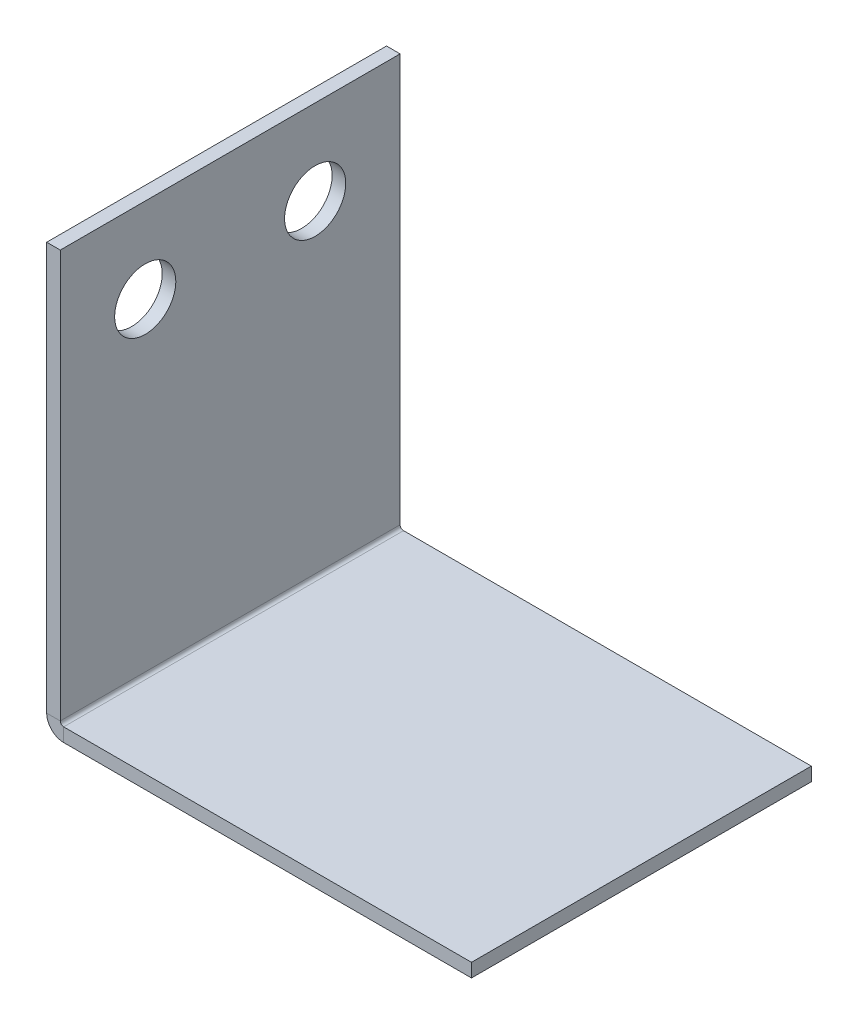
ISO-10303-21;
HEADER;
FILE_DESCRIPTION(('STEP AP214'),'2;1');
FILE_NAME('part.step','',(''),(''),'','','');
FILE_SCHEMA(('AUTOMOTIVE_DESIGN { 1 0 10303 214 1 1 1 1 }'));
ENDSEC;
DATA;
#1=APPLICATION_CONTEXT('core data for automotive mechanical design processes');
#2=APPLICATION_PROTOCOL_DEFINITION('international standard','automotive_design',2000,#1);
#3=PRODUCT_CONTEXT('',#1,'mechanical');
#4=PRODUCT('Part','Part','',(#3));
#5=PRODUCT_RELATED_PRODUCT_CATEGORY('part','',(#4));
#6=PRODUCT_DEFINITION_FORMATION('','',#4);
#7=PRODUCT_DEFINITION_CONTEXT('part definition',#1,'design');
#8=PRODUCT_DEFINITION('design','',#6,#7);
#9=PRODUCT_DEFINITION_SHAPE('','',#8);
#10=(LENGTH_UNIT() NAMED_UNIT(*) SI_UNIT(.MILLI.,.METRE.));
#11=(NAMED_UNIT(*) PLANE_ANGLE_UNIT() SI_UNIT($,.RADIAN.));
#12=(NAMED_UNIT(*) SI_UNIT($,.STERADIAN.) SOLID_ANGLE_UNIT());
#13=UNCERTAINTY_MEASURE_WITH_UNIT(LENGTH_MEASURE(1.E-05),#10,'distance_accuracy_value','');
#14=(GEOMETRIC_REPRESENTATION_CONTEXT(3) GLOBAL_UNCERTAINTY_ASSIGNED_CONTEXT((#13)) GLOBAL_UNIT_ASSIGNED_CONTEXT((#10,
#11,#12)) REPRESENTATION_CONTEXT('',''));
#15=CARTESIAN_POINT('',(0.,0.,0.));
#16=DIRECTION('',(0.,0.,1.));
#17=DIRECTION('',(1.,0.,0.));
#18=AXIS2_PLACEMENT_3D('',#15,#16,#17);
#19=CARTESIAN_POINT('',(0.,-120.,100.));
#20=DIRECTION('',(0.,0.,1.));
#21=DIRECTION('',(1.,0.,0.));
#22=AXIS2_PLACEMENT_3D('',#19,#20,#21);
#23=PLANE('',#22);
#24=DIRECTION('',(1.,0.,0.));
#25=VECTOR('',#24,1.);
#26=CARTESIAN_POINT('',(0.,-120.,100.));
#27=LINE('',#26,#25);
#28=CARTESIAN_POINT('',(0.,-120.,100.));
#29=VERTEX_POINT('',#28);
#30=CARTESIAN_POINT('',(4.00000000000002,-120.,100.));
#31=VERTEX_POINT('',#30);
#32=EDGE_CURVE('E11',#29,#31,#27,.T.);
#33=ORIENTED_EDGE('',*,*,#32,.F.);
#34=CARTESIAN_POINT('',(5.00000000000002,-120.,100.));
#35=DIRECTION('',(0.,0.,-1.));
#36=DIRECTION('',(-1.,0.,0.));
#37=AXIS2_PLACEMENT_3D('',#34,#35,#36);
#38=CIRCLE('',#37,5.);
#39=CARTESIAN_POINT('',(5.00000000000002,-125.,100.));
#40=VERTEX_POINT('',#39);
#41=EDGE_CURVE('E128',#29,#40,#38,.F.);
#42=ORIENTED_EDGE('',*,*,#41,.T.);
#43=DIRECTION('',(0.,-1.,0.));
#44=VECTOR('',#43,1.);
#45=CARTESIAN_POINT('',(5.00000000000002,-121.,100.));
#46=LINE('',#45,#44);
#47=CARTESIAN_POINT('',(5.00000000000002,-121.,100.));
#48=VERTEX_POINT('',#47);
#49=EDGE_CURVE('E45',#48,#40,#46,.T.);
#50=ORIENTED_EDGE('',*,*,#49,.F.);
#51=CARTESIAN_POINT('',(5.00000000000002,-120.,100.));
#52=DIRECTION('',(0.,0.,1.));
#53=DIRECTION('',(1.,0.,0.));
#54=AXIS2_PLACEMENT_3D('',#51,#52,#53);
#55=CIRCLE('',#54,1.);
#56=EDGE_CURVE('E135',#31,#48,#55,.T.);
#57=ORIENTED_EDGE('',*,*,#56,.F.);
#58=EDGE_LOOP('',(#33,#42,#50,#57));
#59=FACE_BOUND('',#58,.T.);
#60=ADVANCED_FACE('F36',(#59),#23,.T.);
#61=CARTESIAN_POINT('',(5.00000000000002,-121.,100.));
#62=DIRECTION('',(0.,0.,1.));
#63=DIRECTION('',(1.,0.,0.));
#64=AXIS2_PLACEMENT_3D('',#61,#62,#63);
#65=PLANE('',#64);
#66=DIRECTION('',(0.,-1.,0.));
#67=VECTOR('',#66,1.);
#68=CARTESIAN_POINT('',(0.,0.,100.));
#69=LINE('',#68,#67);
#70=CARTESIAN_POINT('',(0.,0.,100.));
#71=VERTEX_POINT('',#70);
#72=EDGE_CURVE('E123',#71,#29,#69,.T.);
#73=ORIENTED_EDGE('',*,*,#72,.T.);
#74=ORIENTED_EDGE('',*,*,#32,.T.);
#75=DIRECTION('',(0.,-1.,0.));
#76=VECTOR('',#75,1.);
#77=CARTESIAN_POINT('',(4.,0.,100.));
#78=LINE('',#77,#76);
#79=CARTESIAN_POINT('',(4.,0.,100.));
#80=VERTEX_POINT('',#79);
#81=EDGE_CURVE('E133',#80,#31,#78,.T.);
#82=ORIENTED_EDGE('',*,*,#81,.F.);
#83=DIRECTION('',(1.,0.,0.));
#84=VECTOR('',#83,1.);
#85=CARTESIAN_POINT('',(0.,0.,100.));
#86=LINE('',#85,#84);
#87=EDGE_CURVE('E114',#71,#80,#86,.T.);
#88=ORIENTED_EDGE('',*,*,#87,.F.);
#89=EDGE_LOOP('',(#73,#74,#82,#88));
#90=FACE_BOUND('',#89,.T.);
#91=ADVANCED_FACE('F131',(#90),#65,.T.);
#92=CARTESIAN_POINT('',(5.00000000000002,-125.,0.));
#93=DIRECTION('',(0.,0.,-1.));
#94=DIRECTION('',(-1.,0.,0.));
#95=AXIS2_PLACEMENT_3D('',#92,#93,#94);
#96=PLANE('',#95);
#97=DIRECTION('',(0.,1.,0.));
#98=VECTOR('',#97,1.);
#99=CARTESIAN_POINT('',(5.00000000000002,-125.,0.));
#100=LINE('',#99,#98);
#101=CARTESIAN_POINT('',(5.00000000000002,-125.,0.));
#102=VERTEX_POINT('',#101);
#103=CARTESIAN_POINT('',(5.00000000000002,-121.,0.));
#104=VERTEX_POINT('',#103);
#105=EDGE_CURVE('E89',#102,#104,#100,.T.);
#106=ORIENTED_EDGE('',*,*,#105,.F.);
#107=CARTESIAN_POINT('',(5.00000000000002,-120.,0.));
#108=DIRECTION('',(0.,0.,-1.));
#109=DIRECTION('',(-1.,0.,0.));
#110=AXIS2_PLACEMENT_3D('',#107,#108,#109);
#111=CIRCLE('',#110,5.);
#112=CARTESIAN_POINT('',(0.,-120.,0.));
#113=VERTEX_POINT('',#112);
#114=EDGE_CURVE('E157',#113,#102,#111,.F.);
#115=ORIENTED_EDGE('',*,*,#114,.F.);
#116=DIRECTION('',(-1.,0.,0.));
#117=VECTOR('',#116,1.);
#118=CARTESIAN_POINT('',(4.00000000000002,-120.,0.));
#119=LINE('',#118,#117);
#120=CARTESIAN_POINT('',(4.00000000000002,-120.,0.));
#121=VERTEX_POINT('',#120);
#122=EDGE_CURVE('E82',#121,#113,#119,.T.);
#123=ORIENTED_EDGE('',*,*,#122,.F.);
#124=CARTESIAN_POINT('',(5.00000000000002,-120.,0.));
#125=DIRECTION('',(0.,0.,1.));
#126=DIRECTION('',(1.,0.,0.));
#127=AXIS2_PLACEMENT_3D('',#124,#125,#126);
#128=CIRCLE('',#127,1.);
#129=EDGE_CURVE('E150',#121,#104,#128,.T.);
#130=ORIENTED_EDGE('',*,*,#129,.T.);
#131=EDGE_LOOP('',(#106,#115,#123,#130));
#132=FACE_BOUND('',#131,.T.);
#133=ADVANCED_FACE('F211',(#132),#96,.T.);
#134=CARTESIAN_POINT('',(4.00000000000002,-120.,0.));
#135=DIRECTION('',(0.,0.,-1.));
#136=DIRECTION('',(-1.,0.,0.));
#137=AXIS2_PLACEMENT_3D('',#134,#135,#136);
#138=PLANE('',#137);
#139=DIRECTION('',(1.,0.,0.));
#140=VECTOR('',#139,1.);
#141=CARTESIAN_POINT('',(0.,-125.,0.));
#142=LINE('',#141,#140);
#143=CARTESIAN_POINT('',(125.,-125.,0.));
#144=VERTEX_POINT('',#143);
#145=EDGE_CURVE('E141',#102,#144,#142,.T.);
#146=ORIENTED_EDGE('',*,*,#145,.F.);
#147=ORIENTED_EDGE('',*,*,#105,.T.);
#148=DIRECTION('',(1.,0.,0.));
#149=VECTOR('',#148,1.);
#150=CARTESIAN_POINT('',(0.,-121.,0.));
#151=LINE('',#150,#149);
#152=CARTESIAN_POINT('',(125.,-121.,0.));
#153=VERTEX_POINT('',#152);
#154=EDGE_CURVE('E147',#104,#153,#151,.T.);
#155=ORIENTED_EDGE('',*,*,#154,.T.);
#156=DIRECTION('',(0.,-1.,0.));
#157=VECTOR('',#156,1.);
#158=CARTESIAN_POINT('',(125.,-121.,0.));
#159=LINE('',#158,#157);
#160=EDGE_CURVE('E144',#153,#144,#159,.T.);
#161=ORIENTED_EDGE('',*,*,#160,.T.);
#162=EDGE_LOOP('',(#146,#147,#155,#161));
#163=FACE_BOUND('',#162,.T.);
#164=ADVANCED_FACE('F213',(#163),#138,.T.);
#165=CARTESIAN_POINT('',(0.,-125.,100.));
#166=DIRECTION('',(0.,1.,0.));
#167=DIRECTION('',(0.,0.,1.));
#168=AXIS2_PLACEMENT_3D('',#165,#166,#167);
#169=PLANE('',#168);
#170=ORIENTED_EDGE('',*,*,#145,.T.);
#171=DIRECTION('',(0.,0.,-1.));
#172=VECTOR('',#171,1.);
#173=CARTESIAN_POINT('',(125.,-125.,100.));
#174=LINE('',#173,#172);
#175=CARTESIAN_POINT('',(125.,-125.,100.));
#176=VERTEX_POINT('',#175);
#177=EDGE_CURVE('E171',#176,#144,#174,.T.);
#178=ORIENTED_EDGE('',*,*,#177,.F.);
#179=DIRECTION('',(1.,0.,0.));
#180=VECTOR('',#179,1.);
#181=CARTESIAN_POINT('',(0.,-125.,100.));
#182=LINE('',#181,#180);
#183=EDGE_CURVE('E95',#40,#176,#182,.T.);
#184=ORIENTED_EDGE('',*,*,#183,.F.);
#185=DIRECTION('',(0.,0.,-1.));
#186=VECTOR('',#185,1.);
#187=CARTESIAN_POINT('',(5.00000000000002,-125.,100.));
#188=LINE('',#187,#186);
#189=EDGE_CURVE('E140',#40,#102,#188,.T.);
#190=ORIENTED_EDGE('',*,*,#189,.T.);
#191=EDGE_LOOP('',(#170,#178,#184,#190));
#192=FACE_BOUND('',#191,.T.);
#193=ADVANCED_FACE('F219',(#192),#169,.F.);
#194=CARTESIAN_POINT('',(125.,-121.,100.));
#195=DIRECTION('',(1.,0.,0.));
#196=DIRECTION('',(0.,0.,-1.));
#197=AXIS2_PLACEMENT_3D('',#194,#195,#196);
#198=PLANE('',#197);
#199=ORIENTED_EDGE('',*,*,#160,.F.);
#200=DIRECTION('',(0.,0.,-1.));
#201=VECTOR('',#200,1.);
#202=CARTESIAN_POINT('',(125.,-121.,100.));
#203=LINE('',#202,#201);
#204=CARTESIAN_POINT('',(125.,-121.,100.));
#205=VERTEX_POINT('',#204);
#206=EDGE_CURVE('E169',#205,#153,#203,.T.);
#207=ORIENTED_EDGE('',*,*,#206,.F.);
#208=DIRECTION('',(0.,-1.,0.));
#209=VECTOR('',#208,1.);
#210=CARTESIAN_POINT('',(125.,-121.,100.));
#211=LINE('',#210,#209);
#212=EDGE_CURVE('E190',#205,#176,#211,.T.);
#213=ORIENTED_EDGE('',*,*,#212,.T.);
#214=ORIENTED_EDGE('',*,*,#177,.T.);
#215=EDGE_LOOP('',(#199,#207,#213,#214));
#216=FACE_BOUND('',#215,.T.);
#217=ADVANCED_FACE('F251',(#216),#198,.T.);
#218=CARTESIAN_POINT('',(0.,-121.,100.));
#219=DIRECTION('',(0.,1.,0.));
#220=DIRECTION('',(0.,0.,1.));
#221=AXIS2_PLACEMENT_3D('',#218,#219,#220);
#222=PLANE('',#221);
#223=ORIENTED_EDGE('',*,*,#154,.F.);
#224=DIRECTION('',(0.,0.,-1.));
#225=VECTOR('',#224,1.);
#226=CARTESIAN_POINT('',(5.00000000000002,-121.,100.));
#227=LINE('',#226,#225);
#228=EDGE_CURVE('E166',#48,#104,#227,.T.);
#229=ORIENTED_EDGE('',*,*,#228,.F.);
#230=DIRECTION('',(1.,0.,0.));
#231=VECTOR('',#230,1.);
#232=CARTESIAN_POINT('',(0.,-121.,100.));
#233=LINE('',#232,#231);
#234=EDGE_CURVE('E193',#48,#205,#233,.T.);
#235=ORIENTED_EDGE('',*,*,#234,.T.);
#236=ORIENTED_EDGE('',*,*,#206,.T.);
#237=EDGE_LOOP('',(#223,#229,#235,#236));
#238=FACE_BOUND('',#237,.T.);
#239=ADVANCED_FACE('F262',(#238),#222,.T.);
#240=CARTESIAN_POINT('',(5.00000000000002,-120.,100.));
#241=DIRECTION('',(0.,0.,-1.));
#242=DIRECTION('',(-1.,0.,0.));
#243=AXIS2_PLACEMENT_3D('',#240,#241,#242);
#244=CYLINDRICAL_SURFACE('',#243,1.);
#245=ORIENTED_EDGE('',*,*,#129,.F.);
#246=DIRECTION('',(0.,0.,-1.));
#247=VECTOR('',#246,1.);
#248=CARTESIAN_POINT('',(4.00000000000002,-120.,100.));
#249=LINE('',#248,#247);
#250=EDGE_CURVE('E163',#31,#121,#249,.T.);
#251=ORIENTED_EDGE('',*,*,#250,.F.);
#252=ORIENTED_EDGE('',*,*,#56,.T.);
#253=ORIENTED_EDGE('',*,*,#228,.T.);
#254=EDGE_LOOP('',(#245,#251,#252,#253));
#255=FACE_BOUND('',#254,.T.);
#256=ADVANCED_FACE('F200',(#255),#244,.F.);
#257=CARTESIAN_POINT('',(4.,0.,100.));
#258=DIRECTION('',(1.,0.,0.));
#259=DIRECTION('',(0.,1.,0.));
#260=AXIS2_PLACEMENT_3D('',#257,#258,#259);
#261=PLANE('',#260);
#262=CARTESIAN_POINT('',(4.,-25.,75.));
#263=DIRECTION('',(1.,0.,0.));
#264=DIRECTION('',(0.,1.,0.));
#265=AXIS2_PLACEMENT_3D('',#262,#263,#264);
#266=CIRCLE('',#265,9.);
#267=CARTESIAN_POINT('',(4.,-16.,75.));
#268=VERTEX_POINT('',#267);
#269=EDGE_CURVE('E177',#268,#268,#266,.T.);
#270=ORIENTED_EDGE('',*,*,#269,.F.);
#271=EDGE_LOOP('',(#270));
#272=FACE_BOUND('',#271,.T.);
#273=CARTESIAN_POINT('',(4.,-25.,25.));
#274=DIRECTION('',(1.,0.,0.));
#275=DIRECTION('',(0.,-1.,0.));
#276=AXIS2_PLACEMENT_3D('',#273,#274,#275);
#277=CIRCLE('',#276,9.);
#278=CARTESIAN_POINT('',(4.,-34.,25.));
#279=VERTEX_POINT('',#278);
#280=EDGE_CURVE('E182',#279,#279,#277,.T.);
#281=ORIENTED_EDGE('',*,*,#280,.F.);
#282=EDGE_LOOP('',(#281));
#283=FACE_BOUND('',#282,.T.);
#284=DIRECTION('',(0.,-1.,0.));
#285=VECTOR('',#284,1.);
#286=CARTESIAN_POINT('',(4.,0.,0.));
#287=LINE('',#286,#285);
#288=CARTESIAN_POINT('',(4.,0.,0.));
#289=VERTEX_POINT('',#288);
#290=EDGE_CURVE('E152',#289,#121,#287,.T.);
#291=ORIENTED_EDGE('',*,*,#290,.F.);
#292=DIRECTION('',(0.,0.,-1.));
#293=VECTOR('',#292,1.);
#294=CARTESIAN_POINT('',(4.,0.,100.));
#295=LINE('',#294,#293);
#296=EDGE_CURVE('E118',#80,#289,#295,.T.);
#297=ORIENTED_EDGE('',*,*,#296,.F.);
#298=ORIENTED_EDGE('',*,*,#81,.T.);
#299=ORIENTED_EDGE('',*,*,#250,.T.);
#300=EDGE_LOOP('',(#291,#297,#298,#299));
#301=FACE_BOUND('',#300,.T.);
#302=ADVANCED_FACE('F206',(#272,#283,#301),#261,.T.);
#303=CARTESIAN_POINT('',(0.,0.,100.));
#304=DIRECTION('',(0.,1.,0.));
#305=DIRECTION('',(-1.,0.,0.));
#306=AXIS2_PLACEMENT_3D('',#303,#304,#305);
#307=PLANE('',#306);
#308=DIRECTION('',(1.,0.,0.));
#309=VECTOR('',#308,1.);
#310=CARTESIAN_POINT('',(0.,0.,0.));
#311=LINE('',#310,#309);
#312=CARTESIAN_POINT('',(0.,0.,0.));
#313=VERTEX_POINT('',#312);
#314=EDGE_CURVE('E116',#313,#289,#311,.T.);
#315=ORIENTED_EDGE('',*,*,#314,.F.);
#316=DIRECTION('',(0.,0.,-1.));
#317=VECTOR('',#316,1.);
#318=CARTESIAN_POINT('',(0.,0.,100.));
#319=LINE('',#318,#317);
#320=EDGE_CURVE('E110',#71,#313,#319,.T.);
#321=ORIENTED_EDGE('',*,*,#320,.F.);
#322=ORIENTED_EDGE('',*,*,#87,.T.);
#323=ORIENTED_EDGE('',*,*,#296,.T.);
#324=EDGE_LOOP('',(#315,#321,#322,#323));
#325=FACE_BOUND('',#324,.T.);
#326=ADVANCED_FACE('F112',(#325),#307,.T.);
#327=CARTESIAN_POINT('',(0.,0.,100.));
#328=DIRECTION('',(1.,0.,0.));
#329=DIRECTION('',(0.,1.,0.));
#330=AXIS2_PLACEMENT_3D('',#327,#328,#329);
#331=PLANE('',#330);
#332=CARTESIAN_POINT('',(0.,-25.,75.));
#333=DIRECTION('',(1.,0.,0.));
#334=DIRECTION('',(0.,1.,0.));
#335=AXIS2_PLACEMENT_3D('',#332,#333,#334);
#336=CIRCLE('',#335,9.);
#337=CARTESIAN_POINT('',(0.,-16.,75.));
#338=VERTEX_POINT('',#337);
#339=EDGE_CURVE('E39',#338,#338,#336,.T.);
#340=ORIENTED_EDGE('',*,*,#339,.T.);
#341=EDGE_LOOP('',(#340));
#342=FACE_BOUND('',#341,.T.);
#343=CARTESIAN_POINT('',(0.,-25.,25.));
#344=DIRECTION('',(1.,0.,0.));
#345=DIRECTION('',(0.,1.,0.));
#346=AXIS2_PLACEMENT_3D('',#343,#344,#345);
#347=CIRCLE('',#346,9.);
#348=CARTESIAN_POINT('',(0.,-16.,25.));
#349=VERTEX_POINT('',#348);
#350=EDGE_CURVE('E175',#349,#349,#347,.T.);
#351=ORIENTED_EDGE('',*,*,#350,.T.);
#352=EDGE_LOOP('',(#351));
#353=FACE_BOUND('',#352,.T.);
#354=DIRECTION('',(0.,-1.,0.));
#355=VECTOR('',#354,1.);
#356=CARTESIAN_POINT('',(0.,0.,0.));
#357=LINE('',#356,#355);
#358=EDGE_CURVE('E155',#313,#113,#357,.T.);
#359=ORIENTED_EDGE('',*,*,#358,.T.);
#360=DIRECTION('',(0.,0.,-1.));
#361=VECTOR('',#360,1.);
#362=CARTESIAN_POINT('',(0.,-120.,100.));
#363=LINE('',#362,#361);
#364=EDGE_CURVE('E119',#29,#113,#363,.T.);
#365=ORIENTED_EDGE('',*,*,#364,.F.);
#366=ORIENTED_EDGE('',*,*,#72,.F.);
#367=ORIENTED_EDGE('',*,*,#320,.T.);
#368=EDGE_LOOP('',(#359,#365,#366,#367));
#369=FACE_BOUND('',#368,.T.);
#370=ADVANCED_FACE('F124',(#342,#353,#369),#331,.F.);
#371=CARTESIAN_POINT('',(5.00000000000002,-120.,100.));
#372=DIRECTION('',(0.,0.,-1.));
#373=DIRECTION('',(-1.,0.,0.));
#374=AXIS2_PLACEMENT_3D('',#371,#372,#373);
#375=CYLINDRICAL_SURFACE('',#374,5.);
#376=ORIENTED_EDGE('',*,*,#114,.T.);
#377=ORIENTED_EDGE('',*,*,#189,.F.);
#378=ORIENTED_EDGE('',*,*,#41,.F.);
#379=ORIENTED_EDGE('',*,*,#364,.T.);
#380=EDGE_LOOP('',(#376,#377,#378,#379));
#381=FACE_BOUND('',#380,.T.);
#382=ADVANCED_FACE('F209',(#381),#375,.T.);
#383=CARTESIAN_POINT('',(5.00000000000002,-120.,100.));
#384=DIRECTION('',(0.,0.,1.));
#385=DIRECTION('',(1.,0.,0.));
#386=AXIS2_PLACEMENT_3D('',#383,#384,#385);
#387=PLANE('',#386);
#388=ORIENTED_EDGE('',*,*,#183,.T.);
#389=ORIENTED_EDGE('',*,*,#212,.F.);
#390=ORIENTED_EDGE('',*,*,#234,.F.);
#391=ORIENTED_EDGE('',*,*,#49,.T.);
#392=EDGE_LOOP('',(#388,#389,#390,#391));
#393=FACE_BOUND('',#392,.T.);
#394=ADVANCED_FACE('F305',(#393),#387,.T.);
#395=CARTESIAN_POINT('',(5.00000000000002,-120.,0.));
#396=DIRECTION('',(0.,0.,1.));
#397=DIRECTION('',(1.,0.,0.));
#398=AXIS2_PLACEMENT_3D('',#395,#396,#397);
#399=PLANE('',#398);
#400=ORIENTED_EDGE('',*,*,#290,.T.);
#401=ORIENTED_EDGE('',*,*,#122,.T.);
#402=ORIENTED_EDGE('',*,*,#358,.F.);
#403=ORIENTED_EDGE('',*,*,#314,.T.);
#404=EDGE_LOOP('',(#400,#401,#402,#403));
#405=FACE_BOUND('',#404,.T.);
#406=ADVANCED_FACE('F207',(#405),#399,.F.);
#407=CARTESIAN_POINT('',(-6.,-25.,25.));
#408=DIRECTION('',(1.,0.,0.));
#409=DIRECTION('',(0.,1.,0.));
#410=AXIS2_PLACEMENT_3D('',#407,#408,#409);
#411=CYLINDRICAL_SURFACE('',#410,9.);
#412=ORIENTED_EDGE('',*,*,#280,.T.);
#413=EDGE_LOOP('',(#412));
#414=FACE_BOUND('',#413,.T.);
#415=ORIENTED_EDGE('',*,*,#350,.F.);
#416=EDGE_LOOP('',(#415));
#417=FACE_BOUND('',#416,.T.);
#418=ADVANCED_FACE('F324',(#414,#417),#411,.F.);
#419=CARTESIAN_POINT('',(-6.,-25.,75.));
#420=DIRECTION('',(1.,0.,0.));
#421=DIRECTION('',(0.,1.,0.));
#422=AXIS2_PLACEMENT_3D('',#419,#420,#421);
#423=CYLINDRICAL_SURFACE('',#422,9.);
#424=ORIENTED_EDGE('',*,*,#269,.T.);
#425=EDGE_LOOP('',(#424));
#426=FACE_BOUND('',#425,.T.);
#427=ORIENTED_EDGE('',*,*,#339,.F.);
#428=EDGE_LOOP('',(#427));
#429=FACE_BOUND('',#428,.T.);
#430=ADVANCED_FACE('F350',(#426,#429),#423,.F.);
#431=CLOSED_SHELL('',(#60,#91,#133,#164,#193,#217,#239,#256,#302,#326,#370,#382,#394,#406,#418,#430));
#432=MANIFOLD_SOLID_BREP('B2',#431);
#433=ADVANCED_BREP_SHAPE_REPRESENTATION('',(#18,#432),#14);
#434=SHAPE_DEFINITION_REPRESENTATION(#9,#433);
ENDSEC;
END-ISO-10303-21;
